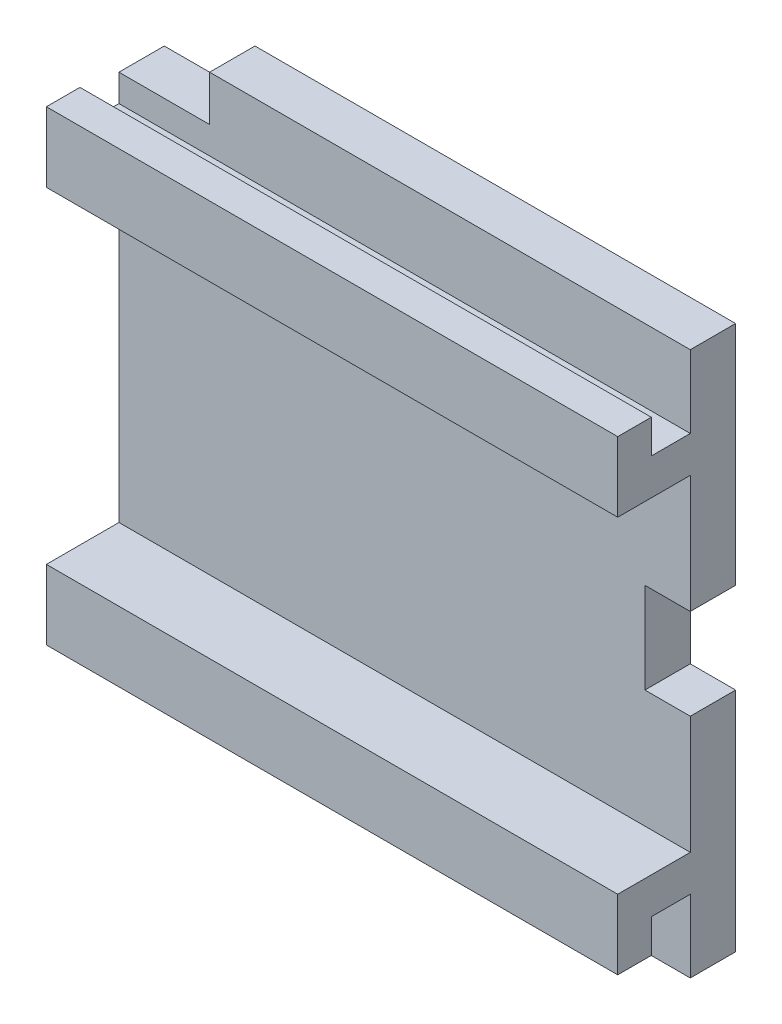
ISO-10303-21;
HEADER;
FILE_DESCRIPTION(('STEP AP214'),'2;1');
FILE_NAME('part.step','',(''),(''),'','','');
FILE_SCHEMA(('AUTOMOTIVE_DESIGN { 1 0 10303 214 1 1 1 1 }'));
ENDSEC;
DATA;
#1=APPLICATION_CONTEXT('core data for automotive mechanical design processes');
#2=APPLICATION_PROTOCOL_DEFINITION('international standard','automotive_design',2000,#1);
#3=PRODUCT_CONTEXT('',#1,'mechanical');
#4=PRODUCT('Part','Part','',(#3));
#5=PRODUCT_RELATED_PRODUCT_CATEGORY('part','',(#4));
#6=PRODUCT_DEFINITION_FORMATION('','',#4);
#7=PRODUCT_DEFINITION_CONTEXT('part definition',#1,'design');
#8=PRODUCT_DEFINITION('design','',#6,#7);
#9=PRODUCT_DEFINITION_SHAPE('','',#8);
#10=(LENGTH_UNIT() NAMED_UNIT(*) SI_UNIT(.MILLI.,.METRE.));
#11=(NAMED_UNIT(*) PLANE_ANGLE_UNIT() SI_UNIT($,.RADIAN.));
#12=(NAMED_UNIT(*) SI_UNIT($,.STERADIAN.) SOLID_ANGLE_UNIT());
#13=UNCERTAINTY_MEASURE_WITH_UNIT(LENGTH_MEASURE(1.E-05),#10,'distance_accuracy_value','');
#14=(GEOMETRIC_REPRESENTATION_CONTEXT(3) GLOBAL_UNCERTAINTY_ASSIGNED_CONTEXT((#13)) GLOBAL_UNIT_ASSIGNED_CONTEXT((#10,
#11,#12)) REPRESENTATION_CONTEXT('',''));
#15=CARTESIAN_POINT('',(0.,0.,0.));
#16=DIRECTION('',(0.,0.,1.));
#17=DIRECTION('',(1.,0.,0.));
#18=AXIS2_PLACEMENT_3D('',#15,#16,#17);
#19=CARTESIAN_POINT('',(0.,0.,5.));
#20=DIRECTION('',(0.,0.,1.));
#21=DIRECTION('',(1.,0.,0.));
#22=AXIS2_PLACEMENT_3D('',#19,#20,#21);
#23=PLANE('',#22);
#24=DIRECTION('',(1.,0.,0.));
#25=VECTOR('',#24,1.);
#26=CARTESIAN_POINT('',(-11.1036030188403,12.,5.));
#27=LINE('',#26,#25);
#28=CARTESIAN_POINT('',(0.,12.,5.));
#29=VERTEX_POINT('',#28);
#30=CARTESIAN_POINT('',(63.,12.,5.));
#31=VERTEX_POINT('',#30);
#32=EDGE_CURVE('E54',#29,#31,#27,.T.);
#33=ORIENTED_EDGE('',*,*,#32,.T.);
#34=DIRECTION('',(0.,1.,0.));
#35=VECTOR('',#34,1.);
#36=CARTESIAN_POINT('',(63.,0.,5.));
#37=LINE('',#36,#35);
#38=CARTESIAN_POINT('',(63.,25.,5.));
#39=VERTEX_POINT('',#38);
#40=EDGE_CURVE('E237',#31,#39,#37,.T.);
#41=ORIENTED_EDGE('',*,*,#40,.T.);
#42=DIRECTION('',(-1.,0.,0.));
#43=VECTOR('',#42,1.);
#44=CARTESIAN_POINT('',(58.,25.,5.));
#45=LINE('',#44,#43);
#46=CARTESIAN_POINT('',(58.,25.,5.));
#47=VERTEX_POINT('',#46);
#48=EDGE_CURVE('E320',#39,#47,#45,.T.);
#49=ORIENTED_EDGE('',*,*,#48,.T.);
#50=DIRECTION('',(0.,1.,0.));
#51=VECTOR('',#50,1.);
#52=CARTESIAN_POINT('',(58.,35.,5.));
#53=LINE('',#52,#51);
#54=CARTESIAN_POINT('',(58.,35.,5.));
#55=VERTEX_POINT('',#54);
#56=EDGE_CURVE('E322',#47,#55,#53,.T.);
#57=ORIENTED_EDGE('',*,*,#56,.T.);
#58=DIRECTION('',(1.,0.,0.));
#59=VECTOR('',#58,1.);
#60=CARTESIAN_POINT('',(63.,35.,5.));
#61=LINE('',#60,#59);
#62=CARTESIAN_POINT('',(63.,35.,5.));
#63=VERTEX_POINT('',#62);
#64=EDGE_CURVE('E324',#55,#63,#61,.T.);
#65=ORIENTED_EDGE('',*,*,#64,.T.);
#66=DIRECTION('',(0.,1.,0.));
#67=VECTOR('',#66,1.);
#68=CARTESIAN_POINT('',(63.,35.,5.));
#69=LINE('',#68,#67);
#70=CARTESIAN_POINT('',(63.,48.,5.));
#71=VERTEX_POINT('',#70);
#72=EDGE_CURVE('E327',#63,#71,#69,.T.);
#73=ORIENTED_EDGE('',*,*,#72,.T.);
#74=DIRECTION('',(1.,0.,0.));
#75=VECTOR('',#74,1.);
#76=CARTESIAN_POINT('',(-11.1036030188403,48.,5.));
#77=LINE('',#76,#75);
#78=CARTESIAN_POINT('',(0.,48.,5.));
#79=VERTEX_POINT('',#78);
#80=EDGE_CURVE('E263',#79,#71,#77,.T.);
#81=ORIENTED_EDGE('',*,*,#80,.F.);
#82=DIRECTION('',(0.,-1.,0.));
#83=VECTOR('',#82,1.);
#84=CARTESIAN_POINT('',(0.,0.,5.));
#85=LINE('',#84,#83);
#86=EDGE_CURVE('E308',#79,#29,#85,.T.);
#87=ORIENTED_EDGE('',*,*,#86,.T.);
#88=EDGE_LOOP('',(#33,#41,#49,#57,#65,#73,#81,#87));
#89=FACE_BOUND('',#88,.T.);
#90=ADVANCED_FACE('F37',(#89),#23,.T.);
#91=CARTESIAN_POINT('',(0.,55.,5.));
#92=VERTEX_POINT('',#91);
#93=CARTESIAN_POINT('',(0.,52.,5.));
#94=VERTEX_POINT('',#93);
#95=EDGE_CURVE('E305',#92,#94,#85,.T.);
#96=ORIENTED_EDGE('',*,*,#95,.T.);
#97=DIRECTION('',(1.,0.,0.));
#98=VECTOR('',#97,1.);
#99=CARTESIAN_POINT('',(-11.1036030188403,52.,5.));
#100=LINE('',#99,#98);
#101=CARTESIAN_POINT('',(63.,52.,5.));
#102=VERTEX_POINT('',#101);
#103=EDGE_CURVE('E284',#94,#102,#100,.T.);
#104=ORIENTED_EDGE('',*,*,#103,.T.);
#105=CARTESIAN_POINT('',(63.,60.,5.));
#106=VERTEX_POINT('',#105);
#107=EDGE_CURVE('E326',#102,#106,#69,.T.);
#108=ORIENTED_EDGE('',*,*,#107,.T.);
#109=DIRECTION('',(-1.,0.,0.));
#110=VECTOR('',#109,1.);
#111=CARTESIAN_POINT('',(10.,60.,5.));
#112=LINE('',#111,#110);
#113=CARTESIAN_POINT('',(10.,60.,5.));
#114=VERTEX_POINT('',#113);
#115=EDGE_CURVE('E329',#106,#114,#112,.T.);
#116=ORIENTED_EDGE('',*,*,#115,.T.);
#117=DIRECTION('',(0.,-1.,0.));
#118=VECTOR('',#117,1.);
#119=CARTESIAN_POINT('',(10.,55.,5.));
#120=LINE('',#119,#118);
#121=CARTESIAN_POINT('',(10.,55.,5.));
#122=VERTEX_POINT('',#121);
#123=EDGE_CURVE('E331',#114,#122,#120,.T.);
#124=ORIENTED_EDGE('',*,*,#123,.T.);
#125=DIRECTION('',(-1.,0.,0.));
#126=VECTOR('',#125,1.);
#127=CARTESIAN_POINT('',(10.,55.,5.));
#128=LINE('',#127,#126);
#129=EDGE_CURVE('E333',#122,#92,#128,.T.);
#130=ORIENTED_EDGE('',*,*,#129,.T.);
#131=EDGE_LOOP('',(#96,#104,#108,#116,#124,#130));
#132=FACE_BOUND('',#131,.T.);
#133=ADVANCED_FACE('F428',(#132),#23,.T.);
#134=CARTESIAN_POINT('',(0.,0.,5.));
#135=DIRECTION('',(1.,0.,0.));
#136=DIRECTION('',(0.,0.,-1.));
#137=AXIS2_PLACEMENT_3D('',#134,#135,#136);
#138=PLANE('',#137);
#139=CARTESIAN_POINT('',(0.,2.5,2.5));
#140=DIRECTION('',(-1.,0.,0.));
#141=DIRECTION('',(0.,0.,1.));
#142=AXIS2_PLACEMENT_3D('',#139,#140,#141);
#143=CIRCLE('',#142,1.5);
#144=CARTESIAN_POINT('',(0.,2.5,4.));
#145=VERTEX_POINT('',#144);
#146=EDGE_CURVE('E299',#145,#145,#143,.T.);
#147=ORIENTED_EDGE('',*,*,#146,.F.);
#148=EDGE_LOOP('',(#147));
#149=FACE_BOUND('',#148,.T.);
#150=DIRECTION('',(0.,-1.,0.));
#151=VECTOR('',#150,1.);
#152=CARTESIAN_POINT('',(0.,0.,0.));
#153=LINE('',#152,#151);
#154=CARTESIAN_POINT('',(0.,55.,0.));
#155=VERTEX_POINT('',#154);
#156=CARTESIAN_POINT('',(0.,0.,0.));
#157=VERTEX_POINT('',#156);
#158=EDGE_CURVE('E336',#155,#157,#153,.T.);
#159=ORIENTED_EDGE('',*,*,#158,.T.);
#160=DIRECTION('',(0.,0.,-1.));
#161=VECTOR('',#160,1.);
#162=CARTESIAN_POINT('',(0.,0.,5.));
#163=LINE('',#162,#161);
#164=CARTESIAN_POINT('',(0.,0.,5.));
#165=VERTEX_POINT('',#164);
#166=EDGE_CURVE('E11',#165,#157,#163,.T.);
#167=ORIENTED_EDGE('',*,*,#166,.F.);
#168=CARTESIAN_POINT('',(0.,8.,4.99999999999999));
#169=VERTEX_POINT('',#168);
#170=EDGE_CURVE('E309',#169,#165,#85,.T.);
#171=ORIENTED_EDGE('',*,*,#170,.F.);
#172=DIRECTION('',(0.,0.,1.));
#173=VECTOR('',#172,1.);
#174=CARTESIAN_POINT('',(0.,8.,4.99999999999999));
#175=LINE('',#174,#173);
#176=CARTESIAN_POINT('',(0.,8.,9.3));
#177=VERTEX_POINT('',#176);
#178=EDGE_CURVE('E453',#169,#177,#175,.T.);
#179=ORIENTED_EDGE('',*,*,#178,.T.);
#180=DIRECTION('',(0.,-1.,0.));
#181=VECTOR('',#180,1.);
#182=CARTESIAN_POINT('',(0.,8.,9.3));
#183=LINE('',#182,#181);
#184=CARTESIAN_POINT('',(0.,4.3,9.3));
#185=VERTEX_POINT('',#184);
#186=EDGE_CURVE('E457',#177,#185,#183,.T.);
#187=ORIENTED_EDGE('',*,*,#186,.T.);
#188=DIRECTION('',(0.,0.,1.));
#189=VECTOR('',#188,1.);
#190=CARTESIAN_POINT('',(0.,4.3,9.3));
#191=LINE('',#190,#189);
#192=CARTESIAN_POINT('',(0.,4.3,13.));
#193=VERTEX_POINT('',#192);
#194=EDGE_CURVE('E249',#185,#193,#191,.T.);
#195=ORIENTED_EDGE('',*,*,#194,.T.);
#196=DIRECTION('',(0.,1.,0.));
#197=VECTOR('',#196,1.);
#198=CARTESIAN_POINT('',(0.,4.3,13.));
#199=LINE('',#198,#197);
#200=CARTESIAN_POINT('',(0.,12.,13.));
#201=VERTEX_POINT('',#200);
#202=EDGE_CURVE('E257',#193,#201,#199,.T.);
#203=ORIENTED_EDGE('',*,*,#202,.T.);
#204=DIRECTION('',(0.,0.,-1.));
#205=VECTOR('',#204,1.);
#206=CARTESIAN_POINT('',(0.,12.,13.));
#207=LINE('',#206,#205);
#208=EDGE_CURVE('E220',#201,#29,#207,.T.);
#209=ORIENTED_EDGE('',*,*,#208,.T.);
#210=ORIENTED_EDGE('',*,*,#86,.F.);
#211=DIRECTION('',(0.,0.,1.));
#212=VECTOR('',#211,1.);
#213=CARTESIAN_POINT('',(0.,48.,13.));
#214=LINE('',#213,#212);
#215=CARTESIAN_POINT('',(0.,48.,13.));
#216=VERTEX_POINT('',#215);
#217=EDGE_CURVE('E267',#79,#216,#214,.T.);
#218=ORIENTED_EDGE('',*,*,#217,.T.);
#219=DIRECTION('',(0.,1.,0.));
#220=VECTOR('',#219,1.);
#221=CARTESIAN_POINT('',(0.,55.7,13.));
#222=LINE('',#221,#220);
#223=CARTESIAN_POINT('',(0.,55.7,13.));
#224=VERTEX_POINT('',#223);
#225=EDGE_CURVE('E265',#216,#224,#222,.T.);
#226=ORIENTED_EDGE('',*,*,#225,.T.);
#227=DIRECTION('',(0.,0.,-1.));
#228=VECTOR('',#227,1.);
#229=CARTESIAN_POINT('',(0.,55.7,9.3));
#230=LINE('',#229,#228);
#231=CARTESIAN_POINT('',(0.,55.7,9.3));
#232=VERTEX_POINT('',#231);
#233=EDGE_CURVE('E262',#224,#232,#230,.T.);
#234=ORIENTED_EDGE('',*,*,#233,.T.);
#235=DIRECTION('',(0.,-1.,0.));
#236=VECTOR('',#235,1.);
#237=CARTESIAN_POINT('',(0.,52.,9.3));
#238=LINE('',#237,#236);
#239=CARTESIAN_POINT('',(0.,52.,9.3));
#240=VERTEX_POINT('',#239);
#241=EDGE_CURVE('E260',#232,#240,#238,.T.);
#242=ORIENTED_EDGE('',*,*,#241,.T.);
#243=DIRECTION('',(0.,0.,-1.));
#244=VECTOR('',#243,1.);
#245=CARTESIAN_POINT('',(0.,52.,5.));
#246=LINE('',#245,#244);
#247=EDGE_CURVE('E269',#240,#94,#246,.T.);
#248=ORIENTED_EDGE('',*,*,#247,.T.);
#249=ORIENTED_EDGE('',*,*,#95,.F.);
#250=DIRECTION('',(0.,0.,-1.));
#251=VECTOR('',#250,1.);
#252=CARTESIAN_POINT('',(0.,55.,5.));
#253=LINE('',#252,#251);
#254=EDGE_CURVE('E335',#92,#155,#253,.T.);
#255=ORIENTED_EDGE('',*,*,#254,.T.);
#256=EDGE_LOOP('',(#159,#167,#171,#179,#187,#195,#203,#209,#210,#218,#226,#234,#242,#248,#249,#255));
#257=FACE_BOUND('',#256,.T.);
#258=ADVANCED_FACE('F39',(#149,#257),#138,.F.);
#259=CARTESIAN_POINT('',(0.,0.,5.));
#260=DIRECTION('',(0.,1.,0.));
#261=DIRECTION('',(-1.,0.,0.));
#262=AXIS2_PLACEMENT_3D('',#259,#260,#261);
#263=PLANE('',#262);
#264=DIRECTION('',(1.,0.,0.));
#265=VECTOR('',#264,1.);
#266=CARTESIAN_POINT('',(0.,0.,0.));
#267=LINE('',#266,#265);
#268=CARTESIAN_POINT('',(10.,0.,0.));
#269=VERTEX_POINT('',#268);
#270=EDGE_CURVE('E339',#157,#269,#267,.T.);
#271=ORIENTED_EDGE('',*,*,#270,.T.);
#272=DIRECTION('',(0.,0.,-1.));
#273=VECTOR('',#272,1.);
#274=CARTESIAN_POINT('',(10.,0.,5.));
#275=LINE('',#274,#273);
#276=CARTESIAN_POINT('',(10.,0.,5.));
#277=VERTEX_POINT('',#276);
#278=EDGE_CURVE('E46',#277,#269,#275,.T.);
#279=ORIENTED_EDGE('',*,*,#278,.F.);
#280=DIRECTION('',(1.,0.,0.));
#281=VECTOR('',#280,1.);
#282=CARTESIAN_POINT('',(0.,0.,5.));
#283=LINE('',#282,#281);
#284=EDGE_CURVE('E307',#165,#277,#283,.T.);
#285=ORIENTED_EDGE('',*,*,#284,.F.);
#286=ORIENTED_EDGE('',*,*,#166,.T.);
#287=EDGE_LOOP('',(#271,#279,#285,#286));
#288=FACE_BOUND('',#287,.T.);
#289=ADVANCED_FACE('F523',(#288),#263,.F.);
#290=CARTESIAN_POINT('',(10.,0.,5.));
#291=DIRECTION('',(-1.,0.,0.));
#292=DIRECTION('',(0.,-1.,0.));
#293=AXIS2_PLACEMENT_3D('',#290,#291,#292);
#294=PLANE('',#293);
#295=CARTESIAN_POINT('',(10.,2.5,2.5));
#296=DIRECTION('',(-1.,0.,0.));
#297=DIRECTION('',(0.,-1.,0.));
#298=AXIS2_PLACEMENT_3D('',#295,#296,#297);
#299=CIRCLE('',#298,1.5);
#300=CARTESIAN_POINT('',(10.,1.,2.5));
#301=VERTEX_POINT('',#300);
#302=EDGE_CURVE('E41',#301,#301,#299,.T.);
#303=ORIENTED_EDGE('',*,*,#302,.T.);
#304=EDGE_LOOP('',(#303));
#305=FACE_BOUND('',#304,.T.);
#306=DIRECTION('',(0.,1.,0.));
#307=VECTOR('',#306,1.);
#308=CARTESIAN_POINT('',(10.,0.,0.));
#309=LINE('',#308,#307);
#310=CARTESIAN_POINT('',(10.,5.,0.));
#311=VERTEX_POINT('',#310);
#312=EDGE_CURVE('E341',#269,#311,#309,.T.);
#313=ORIENTED_EDGE('',*,*,#312,.T.);
#314=DIRECTION('',(0.,0.,-1.));
#315=VECTOR('',#314,1.);
#316=CARTESIAN_POINT('',(10.,5.,5.));
#317=LINE('',#316,#315);
#318=CARTESIAN_POINT('',(10.,5.,5.));
#319=VERTEX_POINT('',#318);
#320=EDGE_CURVE('E397',#319,#311,#317,.T.);
#321=ORIENTED_EDGE('',*,*,#320,.F.);
#322=DIRECTION('',(0.,1.,0.));
#323=VECTOR('',#322,1.);
#324=CARTESIAN_POINT('',(10.,0.,5.));
#325=LINE('',#324,#323);
#326=EDGE_CURVE('E311',#277,#319,#325,.T.);
#327=ORIENTED_EDGE('',*,*,#326,.F.);
#328=ORIENTED_EDGE('',*,*,#278,.T.);
#329=EDGE_LOOP('',(#313,#321,#327,#328));
#330=FACE_BOUND('',#329,.T.);
#331=ADVANCED_FACE('F407',(#305,#330),#294,.F.);
#332=CARTESIAN_POINT('',(10.,5.,5.));
#333=DIRECTION('',(0.,1.,0.));
#334=DIRECTION('',(-1.,0.,0.));
#335=AXIS2_PLACEMENT_3D('',#332,#333,#334);
#336=PLANE('',#335);
#337=DIRECTION('',(1.,0.,0.));
#338=VECTOR('',#337,1.);
#339=CARTESIAN_POINT('',(10.,5.,0.));
#340=LINE('',#339,#338);
#341=CARTESIAN_POINT('',(53.,5.,0.));
#342=VERTEX_POINT('',#341);
#343=EDGE_CURVE('E343',#311,#342,#340,.T.);
#344=ORIENTED_EDGE('',*,*,#343,.T.);
#345=DIRECTION('',(0.,0.,-1.));
#346=VECTOR('',#345,1.);
#347=CARTESIAN_POINT('',(53.,5.,5.));
#348=LINE('',#347,#346);
#349=CARTESIAN_POINT('',(53.,5.,5.));
#350=VERTEX_POINT('',#349);
#351=EDGE_CURVE('E394',#350,#342,#348,.T.);
#352=ORIENTED_EDGE('',*,*,#351,.F.);
#353=DIRECTION('',(1.,0.,0.));
#354=VECTOR('',#353,1.);
#355=CARTESIAN_POINT('',(10.,5.,5.));
#356=LINE('',#355,#354);
#357=EDGE_CURVE('E313',#319,#350,#356,.T.);
#358=ORIENTED_EDGE('',*,*,#357,.F.);
#359=ORIENTED_EDGE('',*,*,#320,.T.);
#360=EDGE_LOOP('',(#344,#352,#358,#359));
#361=FACE_BOUND('',#360,.T.);
#362=ADVANCED_FACE('F574',(#361),#336,.F.);
#363=CARTESIAN_POINT('',(53.,0.,5.));
#364=DIRECTION('',(1.,0.,0.));
#365=DIRECTION('',(0.,0.,-1.));
#366=AXIS2_PLACEMENT_3D('',#363,#364,#365);
#367=PLANE('',#366);
#368=DIRECTION('',(0.,-1.,0.));
#369=VECTOR('',#368,1.);
#370=CARTESIAN_POINT('',(53.,0.,0.));
#371=LINE('',#370,#369);
#372=CARTESIAN_POINT('',(53.,0.,0.));
#373=VERTEX_POINT('',#372);
#374=EDGE_CURVE('E345',#342,#373,#371,.T.);
#375=ORIENTED_EDGE('',*,*,#374,.T.);
#376=DIRECTION('',(0.,0.,-1.));
#377=VECTOR('',#376,1.);
#378=CARTESIAN_POINT('',(53.,0.,5.));
#379=LINE('',#378,#377);
#380=CARTESIAN_POINT('',(53.,0.,5.));
#381=VERTEX_POINT('',#380);
#382=EDGE_CURVE('E391',#381,#373,#379,.T.);
#383=ORIENTED_EDGE('',*,*,#382,.F.);
#384=DIRECTION('',(0.,-1.,0.));
#385=VECTOR('',#384,1.);
#386=CARTESIAN_POINT('',(53.,0.,5.));
#387=LINE('',#386,#385);
#388=EDGE_CURVE('E315',#350,#381,#387,.T.);
#389=ORIENTED_EDGE('',*,*,#388,.F.);
#390=ORIENTED_EDGE('',*,*,#351,.T.);
#391=EDGE_LOOP('',(#375,#383,#389,#390));
#392=FACE_BOUND('',#391,.T.);
#393=ADVANCED_FACE('F570',(#392),#367,.F.);
#394=CARTESIAN_POINT('',(53.,0.,5.));
#395=DIRECTION('',(0.,1.,0.));
#396=DIRECTION('',(0.,0.,1.));
#397=AXIS2_PLACEMENT_3D('',#394,#395,#396);
#398=PLANE('',#397);
#399=DIRECTION('',(1.,0.,0.));
#400=VECTOR('',#399,1.);
#401=CARTESIAN_POINT('',(53.,0.,0.));
#402=LINE('',#401,#400);
#403=CARTESIAN_POINT('',(63.,0.,0.));
#404=VERTEX_POINT('',#403);
#405=EDGE_CURVE('E347',#373,#404,#402,.T.);
#406=ORIENTED_EDGE('',*,*,#405,.T.);
#407=DIRECTION('',(0.,0.,-1.));
#408=VECTOR('',#407,1.);
#409=CARTESIAN_POINT('',(63.,0.,5.));
#410=LINE('',#409,#408);
#411=CARTESIAN_POINT('',(63.,0.,5.));
#412=VERTEX_POINT('',#411);
#413=EDGE_CURVE('E388',#412,#404,#410,.T.);
#414=ORIENTED_EDGE('',*,*,#413,.F.);
#415=DIRECTION('',(1.,0.,0.));
#416=VECTOR('',#415,1.);
#417=CARTESIAN_POINT('',(53.,0.,5.));
#418=LINE('',#417,#416);
#419=EDGE_CURVE('E317',#381,#412,#418,.T.);
#420=ORIENTED_EDGE('',*,*,#419,.F.);
#421=ORIENTED_EDGE('',*,*,#382,.T.);
#422=EDGE_LOOP('',(#406,#414,#420,#421));
#423=FACE_BOUND('',#422,.T.);
#424=ADVANCED_FACE('F567',(#423),#398,.F.);
#425=CARTESIAN_POINT('',(63.,0.,5.));
#426=DIRECTION('',(-1.,0.,0.));
#427=DIRECTION('',(0.,0.,1.));
#428=AXIS2_PLACEMENT_3D('',#425,#426,#427);
#429=PLANE('',#428);
#430=DIRECTION('',(0.,1.,0.));
#431=VECTOR('',#430,1.);
#432=CARTESIAN_POINT('',(63.,0.,0.));
#433=LINE('',#432,#431);
#434=CARTESIAN_POINT('',(63.,25.,0.));
#435=VERTEX_POINT('',#434);
#436=EDGE_CURVE('E349',#404,#435,#433,.T.);
#437=ORIENTED_EDGE('',*,*,#436,.T.);
#438=DIRECTION('',(0.,0.,-1.));
#439=VECTOR('',#438,1.);
#440=CARTESIAN_POINT('',(63.,25.,5.));
#441=LINE('',#440,#439);
#442=EDGE_CURVE('E385',#39,#435,#441,.T.);
#443=ORIENTED_EDGE('',*,*,#442,.F.);
#444=ORIENTED_EDGE('',*,*,#40,.F.);
#445=DIRECTION('',(0.,0.,1.));
#446=VECTOR('',#445,1.);
#447=CARTESIAN_POINT('',(63.,12.,13.));
#448=LINE('',#447,#446);
#449=CARTESIAN_POINT('',(63.,12.,13.));
#450=VERTEX_POINT('',#449);
#451=EDGE_CURVE('E218',#31,#450,#448,.T.);
#452=ORIENTED_EDGE('',*,*,#451,.T.);
#453=DIRECTION('',(0.,-1.,0.));
#454=VECTOR('',#453,1.);
#455=CARTESIAN_POINT('',(63.,4.3,13.));
#456=LINE('',#455,#454);
#457=CARTESIAN_POINT('',(63.,4.3,13.));
#458=VERTEX_POINT('',#457);
#459=EDGE_CURVE('E227',#450,#458,#456,.T.);
#460=ORIENTED_EDGE('',*,*,#459,.T.);
#461=DIRECTION('',(0.,0.,-1.));
#462=VECTOR('',#461,1.);
#463=CARTESIAN_POINT('',(63.,4.3,9.3));
#464=LINE('',#463,#462);
#465=CARTESIAN_POINT('',(63.,4.3,9.3));
#466=VERTEX_POINT('',#465);
#467=EDGE_CURVE('E233',#458,#466,#464,.T.);
#468=ORIENTED_EDGE('',*,*,#467,.T.);
#469=DIRECTION('',(0.,1.,0.));
#470=VECTOR('',#469,1.);
#471=CARTESIAN_POINT('',(63.,8.,9.3));
#472=LINE('',#471,#470);
#473=CARTESIAN_POINT('',(63.,8.,9.3));
#474=VERTEX_POINT('',#473);
#475=EDGE_CURVE('E243',#466,#474,#472,.T.);
#476=ORIENTED_EDGE('',*,*,#475,.T.);
#477=DIRECTION('',(0.,0.,-1.));
#478=VECTOR('',#477,1.);
#479=CARTESIAN_POINT('',(63.,8.,4.99999999999999));
#480=LINE('',#479,#478);
#481=CARTESIAN_POINT('',(63.,8.,5.));
#482=VERTEX_POINT('',#481);
#483=EDGE_CURVE('E224',#474,#482,#480,.T.);
#484=ORIENTED_EDGE('',*,*,#483,.T.);
#485=EDGE_CURVE('E62',#412,#482,#37,.T.);
#486=ORIENTED_EDGE('',*,*,#485,.F.);
#487=ORIENTED_EDGE('',*,*,#413,.T.);
#488=EDGE_LOOP('',(#437,#443,#444,#452,#460,#468,#476,#484,#486,#487));
#489=FACE_BOUND('',#488,.T.);
#490=ADVANCED_FACE('F235',(#489),#429,.F.);
#491=CARTESIAN_POINT('',(58.,25.,5.));
#492=DIRECTION('',(0.,-1.,0.));
#493=DIRECTION('',(1.,0.,0.));
#494=AXIS2_PLACEMENT_3D('',#491,#492,#493);
#495=PLANE('',#494);
#496=DIRECTION('',(-1.,0.,0.));
#497=VECTOR('',#496,1.);
#498=CARTESIAN_POINT('',(58.,25.,0.));
#499=LINE('',#498,#497);
#500=CARTESIAN_POINT('',(58.,25.,0.));
#501=VERTEX_POINT('',#500);
#502=EDGE_CURVE('E351',#435,#501,#499,.T.);
#503=ORIENTED_EDGE('',*,*,#502,.T.);
#504=DIRECTION('',(0.,0.,-1.));
#505=VECTOR('',#504,1.);
#506=CARTESIAN_POINT('',(58.,25.,5.));
#507=LINE('',#506,#505);
#508=EDGE_CURVE('E382',#47,#501,#507,.T.);
#509=ORIENTED_EDGE('',*,*,#508,.F.);
#510=ORIENTED_EDGE('',*,*,#48,.F.);
#511=ORIENTED_EDGE('',*,*,#442,.T.);
#512=EDGE_LOOP('',(#503,#509,#510,#511));
#513=FACE_BOUND('',#512,.T.);
#514=ADVANCED_FACE('F560',(#513),#495,.F.);
#515=CARTESIAN_POINT('',(58.,35.,5.));
#516=DIRECTION('',(-1.,0.,0.));
#517=DIRECTION('',(0.,-1.,0.));
#518=AXIS2_PLACEMENT_3D('',#515,#516,#517);
#519=PLANE('',#518);
#520=DIRECTION('',(0.,1.,0.));
#521=VECTOR('',#520,1.);
#522=CARTESIAN_POINT('',(58.,35.,0.));
#523=LINE('',#522,#521);
#524=CARTESIAN_POINT('',(58.,35.,0.));
#525=VERTEX_POINT('',#524);
#526=EDGE_CURVE('E353',#501,#525,#523,.T.);
#527=ORIENTED_EDGE('',*,*,#526,.T.);
#528=DIRECTION('',(0.,0.,-1.));
#529=VECTOR('',#528,1.);
#530=CARTESIAN_POINT('',(58.,35.,5.));
#531=LINE('',#530,#529);
#532=EDGE_CURVE('E379',#55,#525,#531,.T.);
#533=ORIENTED_EDGE('',*,*,#532,.F.);
#534=ORIENTED_EDGE('',*,*,#56,.F.);
#535=ORIENTED_EDGE('',*,*,#508,.T.);
#536=EDGE_LOOP('',(#527,#533,#534,#535));
#537=FACE_BOUND('',#536,.T.);
#538=ADVANCED_FACE('F557',(#537),#519,.F.);
#539=CARTESIAN_POINT('',(63.,35.,5.));
#540=DIRECTION('',(0.,1.,0.));
#541=DIRECTION('',(0.,0.,1.));
#542=AXIS2_PLACEMENT_3D('',#539,#540,#541);
#543=PLANE('',#542);
#544=DIRECTION('',(1.,0.,0.));
#545=VECTOR('',#544,1.);
#546=CARTESIAN_POINT('',(63.,35.,0.));
#547=LINE('',#546,#545);
#548=CARTESIAN_POINT('',(63.,35.,0.));
#549=VERTEX_POINT('',#548);
#550=EDGE_CURVE('E355',#525,#549,#547,.T.);
#551=ORIENTED_EDGE('',*,*,#550,.T.);
#552=DIRECTION('',(0.,0.,-1.));
#553=VECTOR('',#552,1.);
#554=CARTESIAN_POINT('',(63.,35.,5.));
#555=LINE('',#554,#553);
#556=EDGE_CURVE('E376',#63,#549,#555,.T.);
#557=ORIENTED_EDGE('',*,*,#556,.F.);
#558=ORIENTED_EDGE('',*,*,#64,.F.);
#559=ORIENTED_EDGE('',*,*,#532,.T.);
#560=EDGE_LOOP('',(#551,#557,#558,#559));
#561=FACE_BOUND('',#560,.T.);
#562=ADVANCED_FACE('F538',(#561),#543,.F.);
#563=CARTESIAN_POINT('',(63.,35.,5.));
#564=DIRECTION('',(-1.,0.,0.));
#565=DIRECTION('',(0.,0.,1.));
#566=AXIS2_PLACEMENT_3D('',#563,#564,#565);
#567=PLANE('',#566);
#568=DIRECTION('',(0.,1.,0.));
#569=VECTOR('',#568,1.);
#570=CARTESIAN_POINT('',(63.,35.,0.));
#571=LINE('',#570,#569);
#572=CARTESIAN_POINT('',(63.,60.,0.));
#573=VERTEX_POINT('',#572);
#574=EDGE_CURVE('E357',#549,#573,#571,.T.);
#575=ORIENTED_EDGE('',*,*,#574,.T.);
#576=DIRECTION('',(0.,0.,-1.));
#577=VECTOR('',#576,1.);
#578=CARTESIAN_POINT('',(63.,60.,5.));
#579=LINE('',#578,#577);
#580=EDGE_CURVE('E373',#106,#573,#579,.T.);
#581=ORIENTED_EDGE('',*,*,#580,.F.);
#582=ORIENTED_EDGE('',*,*,#107,.F.);
#583=DIRECTION('',(0.,0.,1.));
#584=VECTOR('',#583,1.);
#585=CARTESIAN_POINT('',(63.,52.,5.));
#586=LINE('',#585,#584);
#587=CARTESIAN_POINT('',(63.,52.,9.3));
#588=VERTEX_POINT('',#587);
#589=EDGE_CURVE('E259',#102,#588,#586,.T.);
#590=ORIENTED_EDGE('',*,*,#589,.T.);
#591=DIRECTION('',(0.,1.,0.));
#592=VECTOR('',#591,1.);
#593=CARTESIAN_POINT('',(63.,52.,9.3));
#594=LINE('',#593,#592);
#595=CARTESIAN_POINT('',(63.,55.7,9.3));
#596=VERTEX_POINT('',#595);
#597=EDGE_CURVE('E272',#588,#596,#594,.T.);
#598=ORIENTED_EDGE('',*,*,#597,.T.);
#599=DIRECTION('',(0.,0.,1.));
#600=VECTOR('',#599,1.);
#601=CARTESIAN_POINT('',(63.,55.7,9.3));
#602=LINE('',#601,#600);
#603=CARTESIAN_POINT('',(63.,55.7,13.));
#604=VERTEX_POINT('',#603);
#605=EDGE_CURVE('E275',#596,#604,#602,.T.);
#606=ORIENTED_EDGE('',*,*,#605,.T.);
#607=DIRECTION('',(0.,-1.,0.));
#608=VECTOR('',#607,1.);
#609=CARTESIAN_POINT('',(63.,55.7,13.));
#610=LINE('',#609,#608);
#611=CARTESIAN_POINT('',(63.,48.,13.));
#612=VERTEX_POINT('',#611);
#613=EDGE_CURVE('E278',#604,#612,#610,.T.);
#614=ORIENTED_EDGE('',*,*,#613,.T.);
#615=DIRECTION('',(0.,0.,-1.));
#616=VECTOR('',#615,1.);
#617=CARTESIAN_POINT('',(63.,48.,13.));
#618=LINE('',#617,#616);
#619=EDGE_CURVE('E281',#612,#71,#618,.T.);
#620=ORIENTED_EDGE('',*,*,#619,.T.);
#621=ORIENTED_EDGE('',*,*,#72,.F.);
#622=ORIENTED_EDGE('',*,*,#556,.T.);
#623=EDGE_LOOP('',(#575,#581,#582,#590,#598,#606,#614,#620,#621,#622));
#624=FACE_BOUND('',#623,.T.);
#625=ADVANCED_FACE('F507',(#624),#567,.F.);
#626=CARTESIAN_POINT('',(10.,60.,5.));
#627=DIRECTION('',(0.,-1.,0.));
#628=DIRECTION('',(1.,0.,0.));
#629=AXIS2_PLACEMENT_3D('',#626,#627,#628);
#630=PLANE('',#629);
#631=DIRECTION('',(-1.,0.,0.));
#632=VECTOR('',#631,1.);
#633=CARTESIAN_POINT('',(10.,60.,0.));
#634=LINE('',#633,#632);
#635=CARTESIAN_POINT('',(10.,60.,0.));
#636=VERTEX_POINT('',#635);
#637=EDGE_CURVE('E359',#573,#636,#634,.T.);
#638=ORIENTED_EDGE('',*,*,#637,.T.);
#639=DIRECTION('',(0.,0.,-1.));
#640=VECTOR('',#639,1.);
#641=CARTESIAN_POINT('',(10.,60.,5.));
#642=LINE('',#641,#640);
#643=EDGE_CURVE('E370',#114,#636,#642,.T.);
#644=ORIENTED_EDGE('',*,*,#643,.F.);
#645=ORIENTED_EDGE('',*,*,#115,.F.);
#646=ORIENTED_EDGE('',*,*,#580,.T.);
#647=EDGE_LOOP('',(#638,#644,#645,#646));
#648=FACE_BOUND('',#647,.T.);
#649=ADVANCED_FACE('F544',(#648),#630,.F.);
#650=CARTESIAN_POINT('',(10.,55.,5.));
#651=DIRECTION('',(1.,0.,0.));
#652=DIRECTION('',(0.,1.,0.));
#653=AXIS2_PLACEMENT_3D('',#650,#651,#652);
#654=PLANE('',#653);
#655=CARTESIAN_POINT('',(10.,57.5,2.5));
#656=DIRECTION('',(1.,0.,0.));
#657=DIRECTION('',(0.,1.,0.));
#658=AXIS2_PLACEMENT_3D('',#655,#656,#657);
#659=CIRCLE('',#658,1.5);
#660=CARTESIAN_POINT('',(10.,59.,2.5));
#661=VERTEX_POINT('',#660);
#662=EDGE_CURVE('E302',#661,#661,#659,.T.);
#663=ORIENTED_EDGE('',*,*,#662,.T.);
#664=EDGE_LOOP('',(#663));
#665=FACE_BOUND('',#664,.T.);
#666=DIRECTION('',(0.,-1.,0.));
#667=VECTOR('',#666,1.);
#668=CARTESIAN_POINT('',(10.,55.,0.));
#669=LINE('',#668,#667);
#670=CARTESIAN_POINT('',(10.,55.,0.));
#671=VERTEX_POINT('',#670);
#672=EDGE_CURVE('E361',#636,#671,#669,.T.);
#673=ORIENTED_EDGE('',*,*,#672,.T.);
#674=DIRECTION('',(0.,0.,-1.));
#675=VECTOR('',#674,1.);
#676=CARTESIAN_POINT('',(10.,55.,5.));
#677=LINE('',#676,#675);
#678=EDGE_CURVE('E367',#122,#671,#677,.T.);
#679=ORIENTED_EDGE('',*,*,#678,.F.);
#680=ORIENTED_EDGE('',*,*,#123,.F.);
#681=ORIENTED_EDGE('',*,*,#643,.T.);
#682=EDGE_LOOP('',(#673,#679,#680,#681));
#683=FACE_BOUND('',#682,.T.);
#684=ADVANCED_FACE('F445',(#665,#683),#654,.F.);
#685=CARTESIAN_POINT('',(10.,55.,5.));
#686=DIRECTION('',(0.,-1.,0.));
#687=DIRECTION('',(0.,0.,-1.));
#688=AXIS2_PLACEMENT_3D('',#685,#686,#687);
#689=PLANE('',#688);
#690=DIRECTION('',(-1.,0.,0.));
#691=VECTOR('',#690,1.);
#692=CARTESIAN_POINT('',(10.,55.,0.));
#693=LINE('',#692,#691);
#694=EDGE_CURVE('E363',#671,#155,#693,.T.);
#695=ORIENTED_EDGE('',*,*,#694,.T.);
#696=ORIENTED_EDGE('',*,*,#254,.F.);
#697=ORIENTED_EDGE('',*,*,#129,.F.);
#698=ORIENTED_EDGE('',*,*,#678,.T.);
#699=EDGE_LOOP('',(#695,#696,#697,#698));
#700=FACE_BOUND('',#699,.T.);
#701=ADVANCED_FACE('F439',(#700),#689,.F.);
#702=DIRECTION('',(1.,0.,0.));
#703=VECTOR('',#702,1.);
#704=CARTESIAN_POINT('',(-11.1036030188403,8.,4.99999999999999));
#705=LINE('',#704,#703);
#706=EDGE_CURVE('E250',#169,#482,#705,.T.);
#707=ORIENTED_EDGE('',*,*,#706,.F.);
#708=ORIENTED_EDGE('',*,*,#170,.T.);
#709=ORIENTED_EDGE('',*,*,#284,.T.);
#710=ORIENTED_EDGE('',*,*,#326,.T.);
#711=ORIENTED_EDGE('',*,*,#357,.T.);
#712=ORIENTED_EDGE('',*,*,#388,.T.);
#713=ORIENTED_EDGE('',*,*,#419,.T.);
#714=ORIENTED_EDGE('',*,*,#485,.T.);
#715=EDGE_LOOP('',(#707,#708,#709,#710,#711,#712,#713,#714));
#716=FACE_BOUND('',#715,.T.);
#717=ADVANCED_FACE('F430',(#716),#23,.T.);
#718=CARTESIAN_POINT('',(0.,0.,0.));
#719=DIRECTION('',(0.,0.,1.));
#720=DIRECTION('',(1.,0.,0.));
#721=AXIS2_PLACEMENT_3D('',#718,#719,#720);
#722=PLANE('',#721);
#723=ORIENTED_EDGE('',*,*,#158,.F.);
#724=ORIENTED_EDGE('',*,*,#694,.F.);
#725=ORIENTED_EDGE('',*,*,#672,.F.);
#726=ORIENTED_EDGE('',*,*,#637,.F.);
#727=ORIENTED_EDGE('',*,*,#574,.F.);
#728=ORIENTED_EDGE('',*,*,#550,.F.);
#729=ORIENTED_EDGE('',*,*,#526,.F.);
#730=ORIENTED_EDGE('',*,*,#502,.F.);
#731=ORIENTED_EDGE('',*,*,#436,.F.);
#732=ORIENTED_EDGE('',*,*,#405,.F.);
#733=ORIENTED_EDGE('',*,*,#374,.F.);
#734=ORIENTED_EDGE('',*,*,#343,.F.);
#735=ORIENTED_EDGE('',*,*,#312,.F.);
#736=ORIENTED_EDGE('',*,*,#270,.F.);
#737=EDGE_LOOP('',(#723,#724,#725,#726,#727,#728,#729,#730,#731,#732,#733,#734,#735,#736));
#738=FACE_BOUND('',#737,.T.);
#739=ADVANCED_FACE('F438',(#738),#722,.F.);
#740=CARTESIAN_POINT('',(15.,57.5,2.5));
#741=DIRECTION('',(-1.,0.,0.));
#742=DIRECTION('',(0.,0.,1.));
#743=AXIS2_PLACEMENT_3D('',#740,#741,#742);
#744=CYLINDRICAL_SURFACE('',#743,1.5);
#745=CARTESIAN_POINT('',(15.,57.5,2.5));
#746=DIRECTION('',(-1.,0.,0.));
#747=DIRECTION('',(0.,0.,1.));
#748=AXIS2_PLACEMENT_3D('',#745,#746,#747);
#749=CIRCLE('',#748,1.5);
#750=CARTESIAN_POINT('',(15.,57.5,4.));
#751=VERTEX_POINT('',#750);
#752=EDGE_CURVE('E298',#751,#751,#749,.T.);
#753=ORIENTED_EDGE('',*,*,#752,.F.);
#754=EDGE_LOOP('',(#753));
#755=FACE_BOUND('',#754,.T.);
#756=ORIENTED_EDGE('',*,*,#662,.F.);
#757=EDGE_LOOP('',(#756));
#758=FACE_BOUND('',#757,.T.);
#759=ADVANCED_FACE('F423',(#755,#758),#744,.F.);
#760=CARTESIAN_POINT('',(15.,57.5,2.5));
#761=DIRECTION('',(-1.,0.,0.));
#762=DIRECTION('',(0.,0.,1.));
#763=AXIS2_PLACEMENT_3D('',#760,#761,#762);
#764=PLANE('',#763);
#765=ORIENTED_EDGE('',*,*,#752,.T.);
#766=EDGE_LOOP('',(#765));
#767=FACE_BOUND('',#766,.T.);
#768=ADVANCED_FACE('F413',(#767),#764,.T.);
#769=CARTESIAN_POINT('',(15.,2.5,2.5));
#770=DIRECTION('',(-1.,0.,0.));
#771=DIRECTION('',(0.,0.,1.));
#772=AXIS2_PLACEMENT_3D('',#769,#770,#771);
#773=CYLINDRICAL_SURFACE('',#772,1.5);
#774=ORIENTED_EDGE('',*,*,#146,.T.);
#775=EDGE_LOOP('',(#774));
#776=FACE_BOUND('',#775,.T.);
#777=ORIENTED_EDGE('',*,*,#302,.F.);
#778=EDGE_LOOP('',(#777));
#779=FACE_BOUND('',#778,.T.);
#780=ADVANCED_FACE('F410',(#776,#779),#773,.F.);
#781=CARTESIAN_POINT('',(-11.1036030188403,48.,13.));
#782=DIRECTION('',(0.,-1.,0.));
#783=DIRECTION('',(0.,0.,-1.));
#784=AXIS2_PLACEMENT_3D('',#781,#782,#783);
#785=PLANE('',#784);
#786=ORIENTED_EDGE('',*,*,#217,.F.);
#787=ORIENTED_EDGE('',*,*,#80,.T.);
#788=ORIENTED_EDGE('',*,*,#619,.F.);
#789=DIRECTION('',(1.,0.,0.));
#790=VECTOR('',#789,1.);
#791=CARTESIAN_POINT('',(-11.1036030188403,48.,13.));
#792=LINE('',#791,#790);
#793=EDGE_CURVE('E287',#216,#612,#792,.T.);
#794=ORIENTED_EDGE('',*,*,#793,.F.);
#795=EDGE_LOOP('',(#786,#787,#788,#794));
#796=FACE_BOUND('',#795,.T.);
#797=ADVANCED_FACE('F412',(#796),#785,.T.);
#798=CARTESIAN_POINT('',(-11.1036030188403,55.7,13.));
#799=DIRECTION('',(0.,0.,1.));
#800=DIRECTION('',(0.,-1.,0.));
#801=AXIS2_PLACEMENT_3D('',#798,#799,#800);
#802=PLANE('',#801);
#803=ORIENTED_EDGE('',*,*,#225,.F.);
#804=ORIENTED_EDGE('',*,*,#793,.T.);
#805=ORIENTED_EDGE('',*,*,#613,.F.);
#806=DIRECTION('',(1.,0.,0.));
#807=VECTOR('',#806,1.);
#808=CARTESIAN_POINT('',(-11.1036030188403,55.7,13.));
#809=LINE('',#808,#807);
#810=EDGE_CURVE('E289',#224,#604,#809,.T.);
#811=ORIENTED_EDGE('',*,*,#810,.F.);
#812=EDGE_LOOP('',(#803,#804,#805,#811));
#813=FACE_BOUND('',#812,.T.);
#814=ADVANCED_FACE('F420',(#813),#802,.T.);
#815=CARTESIAN_POINT('',(-11.1036030188403,55.7,9.3));
#816=DIRECTION('',(0.,1.,0.));
#817=DIRECTION('',(0.,0.,1.));
#818=AXIS2_PLACEMENT_3D('',#815,#816,#817);
#819=PLANE('',#818);
#820=ORIENTED_EDGE('',*,*,#233,.F.);
#821=ORIENTED_EDGE('',*,*,#810,.T.);
#822=ORIENTED_EDGE('',*,*,#605,.F.);
#823=DIRECTION('',(1.,0.,0.));
#824=VECTOR('',#823,1.);
#825=CARTESIAN_POINT('',(-11.1036030188403,55.7,9.3));
#826=LINE('',#825,#824);
#827=EDGE_CURVE('E291',#232,#596,#826,.T.);
#828=ORIENTED_EDGE('',*,*,#827,.F.);
#829=EDGE_LOOP('',(#820,#821,#822,#828));
#830=FACE_BOUND('',#829,.T.);
#831=ADVANCED_FACE('F483',(#830),#819,.T.);
#832=CARTESIAN_POINT('',(-11.1036030188403,52.,9.3));
#833=DIRECTION('',(0.,0.,-1.));
#834=DIRECTION('',(-1.,0.,0.));
#835=AXIS2_PLACEMENT_3D('',#832,#833,#834);
#836=PLANE('',#835);
#837=ORIENTED_EDGE('',*,*,#241,.F.);
#838=ORIENTED_EDGE('',*,*,#827,.T.);
#839=ORIENTED_EDGE('',*,*,#597,.F.);
#840=DIRECTION('',(1.,0.,0.));
#841=VECTOR('',#840,1.);
#842=CARTESIAN_POINT('',(-11.1036030188403,52.,9.3));
#843=LINE('',#842,#841);
#844=EDGE_CURVE('E293',#240,#588,#843,.T.);
#845=ORIENTED_EDGE('',*,*,#844,.F.);
#846=EDGE_LOOP('',(#837,#838,#839,#845));
#847=FACE_BOUND('',#846,.T.);
#848=ADVANCED_FACE('F487',(#847),#836,.T.);
#849=CARTESIAN_POINT('',(-11.1036030188403,52.,5.));
#850=DIRECTION('',(0.,1.,0.));
#851=DIRECTION('',(0.,0.,1.));
#852=AXIS2_PLACEMENT_3D('',#849,#850,#851);
#853=PLANE('',#852);
#854=ORIENTED_EDGE('',*,*,#247,.F.);
#855=ORIENTED_EDGE('',*,*,#844,.T.);
#856=ORIENTED_EDGE('',*,*,#589,.F.);
#857=ORIENTED_EDGE('',*,*,#103,.F.);
#858=EDGE_LOOP('',(#854,#855,#856,#857));
#859=FACE_BOUND('',#858,.T.);
#860=ADVANCED_FACE('F479',(#859),#853,.T.);
#861=CARTESIAN_POINT('',(-11.1036030188403,12.,13.));
#862=DIRECTION('',(0.,1.,0.));
#863=DIRECTION('',(0.,0.,1.));
#864=AXIS2_PLACEMENT_3D('',#861,#862,#863);
#865=PLANE('',#864);
#866=ORIENTED_EDGE('',*,*,#208,.F.);
#867=DIRECTION('',(1.,0.,0.));
#868=VECTOR('',#867,1.);
#869=CARTESIAN_POINT('',(-11.1036030188403,12.,13.));
#870=LINE('',#869,#868);
#871=EDGE_CURVE('E214',#201,#450,#870,.T.);
#872=ORIENTED_EDGE('',*,*,#871,.T.);
#873=ORIENTED_EDGE('',*,*,#451,.F.);
#874=ORIENTED_EDGE('',*,*,#32,.F.);
#875=EDGE_LOOP('',(#866,#872,#873,#874));
#876=FACE_BOUND('',#875,.T.);
#877=ADVANCED_FACE('F216',(#876),#865,.T.);
#878=CARTESIAN_POINT('',(-11.1036030188403,8.,4.99999999999999));
#879=DIRECTION('',(0.,-1.,0.));
#880=DIRECTION('',(0.,0.,-1.));
#881=AXIS2_PLACEMENT_3D('',#878,#879,#880);
#882=PLANE('',#881);
#883=ORIENTED_EDGE('',*,*,#178,.F.);
#884=ORIENTED_EDGE('',*,*,#706,.T.);
#885=ORIENTED_EDGE('',*,*,#483,.F.);
#886=DIRECTION('',(1.,0.,0.));
#887=VECTOR('',#886,1.);
#888=CARTESIAN_POINT('',(-11.1036030188403,8.,9.3));
#889=LINE('',#888,#887);
#890=EDGE_CURVE('E252',#177,#474,#889,.T.);
#891=ORIENTED_EDGE('',*,*,#890,.F.);
#892=EDGE_LOOP('',(#883,#884,#885,#891));
#893=FACE_BOUND('',#892,.T.);
#894=ADVANCED_FACE('F454',(#893),#882,.T.);
#895=CARTESIAN_POINT('',(-11.1036030188403,8.,9.3));
#896=DIRECTION('',(0.,0.,-1.));
#897=DIRECTION('',(0.,1.,0.));
#898=AXIS2_PLACEMENT_3D('',#895,#896,#897);
#899=PLANE('',#898);
#900=ORIENTED_EDGE('',*,*,#186,.F.);
#901=ORIENTED_EDGE('',*,*,#890,.T.);
#902=ORIENTED_EDGE('',*,*,#475,.F.);
#903=DIRECTION('',(1.,0.,0.));
#904=VECTOR('',#903,1.);
#905=CARTESIAN_POINT('',(-11.1036030188403,4.3,9.3));
#906=LINE('',#905,#904);
#907=EDGE_CURVE('E254',#185,#466,#906,.T.);
#908=ORIENTED_EDGE('',*,*,#907,.F.);
#909=EDGE_LOOP('',(#900,#901,#902,#908));
#910=FACE_BOUND('',#909,.T.);
#911=ADVANCED_FACE('F466',(#910),#899,.T.);
#912=CARTESIAN_POINT('',(-11.1036030188403,4.3,9.3));
#913=DIRECTION('',(0.,-1.,0.));
#914=DIRECTION('',(0.,0.,-1.));
#915=AXIS2_PLACEMENT_3D('',#912,#913,#914);
#916=PLANE('',#915);
#917=ORIENTED_EDGE('',*,*,#194,.F.);
#918=ORIENTED_EDGE('',*,*,#907,.T.);
#919=ORIENTED_EDGE('',*,*,#467,.F.);
#920=DIRECTION('',(1.,0.,0.));
#921=VECTOR('',#920,1.);
#922=CARTESIAN_POINT('',(-11.1036030188403,4.3,13.));
#923=LINE('',#922,#921);
#924=EDGE_CURVE('E223',#193,#458,#923,.T.);
#925=ORIENTED_EDGE('',*,*,#924,.F.);
#926=EDGE_LOOP('',(#917,#918,#919,#925));
#927=FACE_BOUND('',#926,.T.);
#928=ADVANCED_FACE('F463',(#927),#916,.T.);
#929=CARTESIAN_POINT('',(-11.1036030188403,4.3,13.));
#930=DIRECTION('',(0.,0.,1.));
#931=DIRECTION('',(1.,0.,0.));
#932=AXIS2_PLACEMENT_3D('',#929,#930,#931);
#933=PLANE('',#932);
#934=ORIENTED_EDGE('',*,*,#202,.F.);
#935=ORIENTED_EDGE('',*,*,#924,.T.);
#936=ORIENTED_EDGE('',*,*,#459,.F.);
#937=ORIENTED_EDGE('',*,*,#871,.F.);
#938=EDGE_LOOP('',(#934,#935,#936,#937));
#939=FACE_BOUND('',#938,.T.);
#940=ADVANCED_FACE('F228',(#939),#933,.T.);
#941=CLOSED_SHELL('',(#90,#133,#258,#289,#331,#362,#393,#424,#490,#514,#538,#562,#625,#649,#684,
#701,#717,#739,#759,#768,#780,#797,#814,#831,#848,#860,#877,#894,#911,#928,#940));
#942=MANIFOLD_SOLID_BREP('B2',#941);
#943=ADVANCED_BREP_SHAPE_REPRESENTATION('',(#18,#942),#14);
#944=SHAPE_DEFINITION_REPRESENTATION(#9,#943);
ENDSEC;
END-ISO-10303-21;
